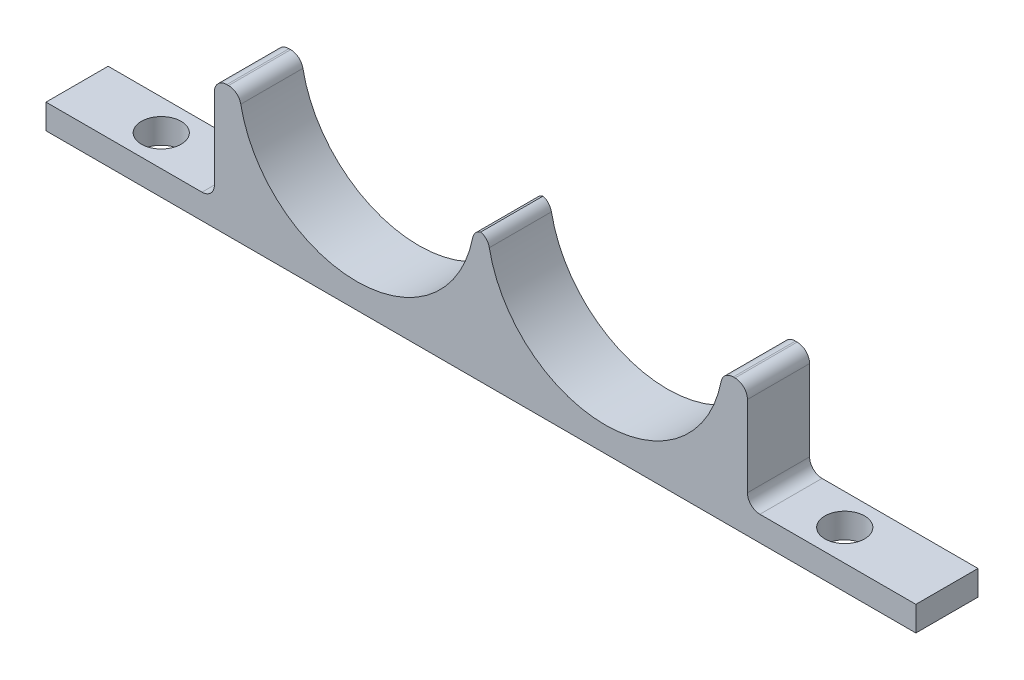
ISO-10303-21;
HEADER;
FILE_DESCRIPTION(('STEP AP214'),'2;1');
FILE_NAME('part.step','',(''),(''),'','','');
FILE_SCHEMA(('AUTOMOTIVE_DESIGN { 1 0 10303 214 1 1 1 1 }'));
ENDSEC;
DATA;
#1=APPLICATION_CONTEXT('core data for automotive mechanical design processes');
#2=APPLICATION_PROTOCOL_DEFINITION('international standard','automotive_design',2000,#1);
#3=PRODUCT_CONTEXT('',#1,'mechanical');
#4=PRODUCT('Part','Part','',(#3));
#5=PRODUCT_RELATED_PRODUCT_CATEGORY('part','',(#4));
#6=PRODUCT_DEFINITION_FORMATION('','',#4);
#7=PRODUCT_DEFINITION_CONTEXT('part definition',#1,'design');
#8=PRODUCT_DEFINITION('design','',#6,#7);
#9=PRODUCT_DEFINITION_SHAPE('','',#8);
#10=(LENGTH_UNIT() NAMED_UNIT(*) SI_UNIT(.MILLI.,.METRE.));
#11=(NAMED_UNIT(*) PLANE_ANGLE_UNIT() SI_UNIT($,.RADIAN.));
#12=(NAMED_UNIT(*) SI_UNIT($,.STERADIAN.) SOLID_ANGLE_UNIT());
#13=UNCERTAINTY_MEASURE_WITH_UNIT(LENGTH_MEASURE(1.E-05),#10,'distance_accuracy_value','');
#14=(GEOMETRIC_REPRESENTATION_CONTEXT(3) GLOBAL_UNCERTAINTY_ASSIGNED_CONTEXT((#13)) GLOBAL_UNIT_ASSIGNED_CONTEXT((#10,
#11,#12)) REPRESENTATION_CONTEXT('',''));
#15=CARTESIAN_POINT('',(0.,0.,0.));
#16=DIRECTION('',(0.,0.,1.));
#17=DIRECTION('',(1.,0.,0.));
#18=AXIS2_PLACEMENT_3D('',#15,#16,#17);
#19=CARTESIAN_POINT('',(0.,0.,5.));
#20=DIRECTION('',(1.,0.,0.));
#21=DIRECTION('',(0.,0.,-1.));
#22=AXIS2_PLACEMENT_3D('',#19,#20,#21);
#23=PLANE('',#22);
#24=DIRECTION('',(0.,-1.,0.));
#25=VECTOR('',#24,1.);
#26=CARTESIAN_POINT('',(0.,0.,0.));
#27=LINE('',#26,#25);
#28=CARTESIAN_POINT('',(0.,2.,0.));
#29=VERTEX_POINT('',#28);
#30=CARTESIAN_POINT('',(0.,0.,0.));
#31=VERTEX_POINT('',#30);
#32=EDGE_CURVE('E189',#29,#31,#27,.T.);
#33=ORIENTED_EDGE('',*,*,#32,.T.);
#34=DIRECTION('',(0.,0.,-1.));
#35=VECTOR('',#34,1.);
#36=CARTESIAN_POINT('',(0.,0.,5.));
#37=LINE('',#36,#35);
#38=CARTESIAN_POINT('',(0.,0.,5.));
#39=VERTEX_POINT('',#38);
#40=EDGE_CURVE('E170',#39,#31,#37,.T.);
#41=ORIENTED_EDGE('',*,*,#40,.F.);
#42=DIRECTION('',(0.,-1.,0.));
#43=VECTOR('',#42,1.);
#44=CARTESIAN_POINT('',(0.,0.,5.));
#45=LINE('',#44,#43);
#46=CARTESIAN_POINT('',(0.,2.,5.));
#47=VERTEX_POINT('',#46);
#48=EDGE_CURVE('E176',#47,#39,#45,.T.);
#49=ORIENTED_EDGE('',*,*,#48,.F.);
#50=DIRECTION('',(0.,0.,-1.));
#51=VECTOR('',#50,1.);
#52=CARTESIAN_POINT('',(0.,2.,5.));
#53=LINE('',#52,#51);
#54=EDGE_CURVE('E305',#47,#29,#53,.T.);
#55=ORIENTED_EDGE('',*,*,#54,.T.);
#56=EDGE_LOOP('',(#33,#41,#49,#55));
#57=FACE_BOUND('',#56,.T.);
#58=ADVANCED_FACE('F35',(#57),#23,.F.);
#59=CARTESIAN_POINT('',(0.,0.,5.));
#60=DIRECTION('',(0.,1.,0.));
#61=DIRECTION('',(0.,0.,1.));
#62=AXIS2_PLACEMENT_3D('',#59,#60,#61);
#63=PLANE('',#62);
#64=CARTESIAN_POINT('',(6.77638909307721,0.,2.5));
#65=DIRECTION('',(0.,1.,0.));
#66=DIRECTION('',(0.,0.,1.));
#67=AXIS2_PLACEMENT_3D('',#64,#65,#66);
#68=CIRCLE('',#67,1.6);
#69=CARTESIAN_POINT('',(6.77638909307721,0.,4.1));
#70=VERTEX_POINT('',#69);
#71=EDGE_CURVE('E308',#70,#70,#68,.T.);
#72=ORIENTED_EDGE('',*,*,#71,.T.);
#73=EDGE_LOOP('',(#72));
#74=FACE_BOUND('',#73,.T.);
#75=CARTESIAN_POINT('',(61.7763890930772,0.,2.5));
#76=DIRECTION('',(0.,1.,0.));
#77=DIRECTION('',(0.,0.,-1.));
#78=AXIS2_PLACEMENT_3D('',#75,#76,#77);
#79=CIRCLE('',#78,1.6);
#80=CARTESIAN_POINT('',(61.7763890930772,0.,0.900000000000002));
#81=VERTEX_POINT('',#80);
#82=EDGE_CURVE('E335',#81,#81,#79,.T.);
#83=ORIENTED_EDGE('',*,*,#82,.T.);
#84=EDGE_LOOP('',(#83));
#85=FACE_BOUND('',#84,.T.);
#86=DIRECTION('',(1.,0.,0.));
#87=VECTOR('',#86,1.);
#88=CARTESIAN_POINT('',(0.,0.,0.));
#89=LINE('',#88,#87);
#90=CARTESIAN_POINT('',(70.,0.,0.));
#91=VERTEX_POINT('',#90);
#92=EDGE_CURVE('E307',#31,#91,#89,.T.);
#93=ORIENTED_EDGE('',*,*,#92,.T.);
#94=DIRECTION('',(0.,0.,-1.));
#95=VECTOR('',#94,1.);
#96=CARTESIAN_POINT('',(70.,0.,5.));
#97=LINE('',#96,#95);
#98=CARTESIAN_POINT('',(70.,0.,5.));
#99=VERTEX_POINT('',#98);
#100=EDGE_CURVE('E173',#99,#91,#97,.T.);
#101=ORIENTED_EDGE('',*,*,#100,.F.);
#102=DIRECTION('',(1.,0.,0.));
#103=VECTOR('',#102,1.);
#104=CARTESIAN_POINT('',(0.,0.,5.));
#105=LINE('',#104,#103);
#106=EDGE_CURVE('E166',#39,#99,#105,.T.);
#107=ORIENTED_EDGE('',*,*,#106,.F.);
#108=ORIENTED_EDGE('',*,*,#40,.T.);
#109=EDGE_LOOP('',(#93,#101,#107,#108));
#110=FACE_BOUND('',#109,.T.);
#111=ADVANCED_FACE('F168',(#74,#85,#110),#63,.F.);
#112=CARTESIAN_POINT('',(70.,0.,5.));
#113=DIRECTION('',(-1.,0.,0.));
#114=DIRECTION('',(0.,0.,1.));
#115=AXIS2_PLACEMENT_3D('',#112,#113,#114);
#116=PLANE('',#115);
#117=DIRECTION('',(0.,1.,0.));
#118=VECTOR('',#117,1.);
#119=CARTESIAN_POINT('',(70.,0.,0.));
#120=LINE('',#119,#118);
#121=CARTESIAN_POINT('',(70.,2.,0.));
#122=VERTEX_POINT('',#121);
#123=EDGE_CURVE('E277',#91,#122,#120,.T.);
#124=ORIENTED_EDGE('',*,*,#123,.T.);
#125=DIRECTION('',(0.,0.,-1.));
#126=VECTOR('',#125,1.);
#127=CARTESIAN_POINT('',(70.,2.,5.));
#128=LINE('',#127,#126);
#129=CARTESIAN_POINT('',(70.,2.,5.));
#130=VERTEX_POINT('',#129);
#131=EDGE_CURVE('E195',#130,#122,#128,.T.);
#132=ORIENTED_EDGE('',*,*,#131,.F.);
#133=DIRECTION('',(0.,1.,0.));
#134=VECTOR('',#133,1.);
#135=CARTESIAN_POINT('',(70.,0.,5.));
#136=LINE('',#135,#134);
#137=EDGE_CURVE('E175',#99,#130,#136,.T.);
#138=ORIENTED_EDGE('',*,*,#137,.F.);
#139=ORIENTED_EDGE('',*,*,#100,.T.);
#140=EDGE_LOOP('',(#124,#132,#138,#139));
#141=FACE_BOUND('',#140,.T.);
#142=ADVANCED_FACE('F330',(#141),#116,.F.);
#143=CARTESIAN_POINT('',(56.4472218138456,2.,5.));
#144=DIRECTION('',(0.,-1.,0.));
#145=DIRECTION('',(0.,0.,-1.));
#146=AXIS2_PLACEMENT_3D('',#143,#144,#145);
#147=PLANE('',#146);
#148=CARTESIAN_POINT('',(61.7763890930772,2.,2.5));
#149=DIRECTION('',(0.,1.,0.));
#150=DIRECTION('',(0.,0.,-1.));
#151=AXIS2_PLACEMENT_3D('',#148,#149,#150);
#152=CIRCLE('',#151,1.6);
#153=CARTESIAN_POINT('',(61.7763890930772,2.,0.900000000000002));
#154=VERTEX_POINT('',#153);
#155=EDGE_CURVE('E332',#154,#154,#152,.T.);
#156=ORIENTED_EDGE('',*,*,#155,.F.);
#157=EDGE_LOOP('',(#156));
#158=FACE_BOUND('',#157,.T.);
#159=DIRECTION('',(-1.,0.,0.));
#160=VECTOR('',#159,1.);
#161=CARTESIAN_POINT('',(56.4472218138456,2.,0.));
#162=LINE('',#161,#160);
#163=CARTESIAN_POINT('',(57.4472218138456,2.,0.));
#164=VERTEX_POINT('',#163);
#165=EDGE_CURVE('E265',#122,#164,#162,.T.);
#166=ORIENTED_EDGE('',*,*,#165,.T.);
#167=DIRECTION('',(0.,0.,-1.));
#168=VECTOR('',#167,1.);
#169=CARTESIAN_POINT('',(57.4472218138456,2.,5.));
#170=LINE('',#169,#168);
#171=CARTESIAN_POINT('',(57.4472218138456,2.,5.));
#172=VERTEX_POINT('',#171);
#173=EDGE_CURVE('E211',#164,#172,#170,.F.);
#174=ORIENTED_EDGE('',*,*,#173,.T.);
#175=DIRECTION('',(-1.,0.,0.));
#176=VECTOR('',#175,1.);
#177=CARTESIAN_POINT('',(56.4472218138456,2.,5.));
#178=LINE('',#177,#176);
#179=EDGE_CURVE('E285',#130,#172,#178,.T.);
#180=ORIENTED_EDGE('',*,*,#179,.F.);
#181=ORIENTED_EDGE('',*,*,#131,.T.);
#182=EDGE_LOOP('',(#166,#174,#180,#181));
#183=FACE_BOUND('',#182,.T.);
#184=ADVANCED_FACE('F273',(#158,#183),#147,.F.);
#185=CARTESIAN_POINT('',(56.4472218138456,10.5,5.));
#186=DIRECTION('',(-1.,0.,0.));
#187=DIRECTION('',(0.,0.,1.));
#188=AXIS2_PLACEMENT_3D('',#185,#186,#187);
#189=PLANE('',#188);
#190=DIRECTION('',(0.,1.,0.));
#191=VECTOR('',#190,1.);
#192=CARTESIAN_POINT('',(56.4472218138456,10.5,5.));
#193=LINE('',#192,#191);
#194=CARTESIAN_POINT('',(56.4472218138456,3.,5.));
#195=VERTEX_POINT('',#194);
#196=CARTESIAN_POINT('',(56.4472218138456,9.5,5.));
#197=VERTEX_POINT('',#196);
#198=EDGE_CURVE('E283',#195,#197,#193,.T.);
#199=ORIENTED_EDGE('',*,*,#198,.F.);
#200=DIRECTION('',(0.,0.,-1.));
#201=VECTOR('',#200,1.);
#202=CARTESIAN_POINT('',(56.4472218138456,3.,0.));
#203=LINE('',#202,#201);
#204=CARTESIAN_POINT('',(56.4472218138456,3.,0.));
#205=VERTEX_POINT('',#204);
#206=EDGE_CURVE('E208',#195,#205,#203,.T.);
#207=ORIENTED_EDGE('',*,*,#206,.T.);
#208=DIRECTION('',(0.,1.,0.));
#209=VECTOR('',#208,1.);
#210=CARTESIAN_POINT('',(56.4472218138456,10.5,0.));
#211=LINE('',#210,#209);
#212=CARTESIAN_POINT('',(56.4472218138456,9.5,0.));
#213=VERTEX_POINT('',#212);
#214=EDGE_CURVE('E267',#205,#213,#211,.T.);
#215=ORIENTED_EDGE('',*,*,#214,.T.);
#216=DIRECTION('',(0.,0.,-1.));
#217=VECTOR('',#216,1.);
#218=CARTESIAN_POINT('',(56.4472218138456,9.5,5.));
#219=LINE('',#218,#217);
#220=EDGE_CURVE('E206',#213,#197,#219,.F.);
#221=ORIENTED_EDGE('',*,*,#220,.T.);
#222=EDGE_LOOP('',(#199,#207,#215,#221));
#223=FACE_BOUND('',#222,.T.);
#224=ADVANCED_FACE('F287',(#223),#189,.F.);
#225=CARTESIAN_POINT('',(54.4472218138456,10.5,5.));
#226=DIRECTION('',(0.,-1.,0.));
#227=DIRECTION('',(0.,0.,-1.));
#228=AXIS2_PLACEMENT_3D('',#225,#226,#227);
#229=PLANE('',#228);
#230=DIRECTION('',(-1.,0.,0.));
#231=VECTOR('',#230,1.);
#232=CARTESIAN_POINT('',(54.4472218138456,10.5,0.));
#233=LINE('',#232,#231);
#234=CARTESIAN_POINT('',(55.4472218138456,10.5,0.));
#235=VERTEX_POINT('',#234);
#236=CARTESIAN_POINT('',(55.3077640640442,10.5,0.));
#237=VERTEX_POINT('',#236);
#238=EDGE_CURVE('E312',#235,#237,#233,.T.);
#239=ORIENTED_EDGE('',*,*,#238,.T.);
#240=DIRECTION('',(0.,0.,-1.));
#241=VECTOR('',#240,1.);
#242=CARTESIAN_POINT('',(55.3077640640442,10.5,5.));
#243=LINE('',#242,#241);
#244=CARTESIAN_POINT('',(55.3077640640442,10.5,5.));
#245=VERTEX_POINT('',#244);
#246=EDGE_CURVE('E234',#237,#245,#243,.F.);
#247=ORIENTED_EDGE('',*,*,#246,.T.);
#248=DIRECTION('',(-1.,0.,0.));
#249=VECTOR('',#248,1.);
#250=CARTESIAN_POINT('',(54.4472218138456,10.5,5.));
#251=LINE('',#250,#249);
#252=CARTESIAN_POINT('',(55.4472218138456,10.5,5.));
#253=VERTEX_POINT('',#252);
#254=EDGE_CURVE('E289',#253,#245,#251,.T.);
#255=ORIENTED_EDGE('',*,*,#254,.F.);
#256=DIRECTION('',(0.,0.,-1.));
#257=VECTOR('',#256,1.);
#258=CARTESIAN_POINT('',(55.4472218138456,10.5,5.));
#259=LINE('',#258,#257);
#260=EDGE_CURVE('E231',#253,#235,#259,.T.);
#261=ORIENTED_EDGE('',*,*,#260,.T.);
#262=EDGE_LOOP('',(#239,#247,#255,#261));
#263=FACE_BOUND('',#262,.T.);
#264=ADVANCED_FACE('F426',(#263),#229,.F.);
#265=CARTESIAN_POINT('',(45.,11.5,5.));
#266=DIRECTION('',(0.,0.,-1.));
#267=DIRECTION('',(-1.,0.,0.));
#268=AXIS2_PLACEMENT_3D('',#265,#266,#267);
#269=CYLINDRICAL_SURFACE('',#268,9.50000000000001);
#270=CARTESIAN_POINT('',(45.,11.5,5.));
#271=DIRECTION('',(0.,0.,-1.));
#272=DIRECTION('',(1.,0.,0.));
#273=AXIS2_PLACEMENT_3D('',#270,#271,#272);
#274=CIRCLE('',#273,9.50000000000001);
#275=CARTESIAN_POINT('',(54.3260722484209,9.69047619047619,5.));
#276=VERTEX_POINT('',#275);
#277=CARTESIAN_POINT('',(35.6739277515791,9.69047619047619,5.));
#278=VERTEX_POINT('',#277);
#279=EDGE_CURVE('E291',#276,#278,#274,.T.);
#280=ORIENTED_EDGE('',*,*,#279,.F.);
#281=DIRECTION('',(0.,0.,-1.));
#282=VECTOR('',#281,1.);
#283=CARTESIAN_POINT('',(54.3260722484209,9.69047619047619,5.));
#284=LINE('',#283,#282);
#285=CARTESIAN_POINT('',(54.3260722484209,9.69047619047619,0.));
#286=VERTEX_POINT('',#285);
#287=EDGE_CURVE('E216',#276,#286,#284,.T.);
#288=ORIENTED_EDGE('',*,*,#287,.T.);
#289=CARTESIAN_POINT('',(45.,11.5,0.));
#290=DIRECTION('',(0.,0.,-1.));
#291=DIRECTION('',(1.,0.,0.));
#292=AXIS2_PLACEMENT_3D('',#289,#290,#291);
#293=CIRCLE('',#292,9.50000000000001);
#294=CARTESIAN_POINT('',(35.6739277515791,9.69047619047619,0.));
#295=VERTEX_POINT('',#294);
#296=EDGE_CURVE('E315',#286,#295,#293,.T.);
#297=ORIENTED_EDGE('',*,*,#296,.T.);
#298=DIRECTION('',(0.,0.,-1.));
#299=VECTOR('',#298,1.);
#300=CARTESIAN_POINT('',(35.6739277515791,9.69047619047619,5.));
#301=LINE('',#300,#299);
#302=EDGE_CURVE('E213',#295,#278,#301,.F.);
#303=ORIENTED_EDGE('',*,*,#302,.T.);
#304=EDGE_LOOP('',(#280,#288,#297,#303));
#305=FACE_BOUND('',#304,.T.);
#306=ADVANCED_FACE('F391',(#305),#269,.F.);
#307=CARTESIAN_POINT('',(25.,11.5,5.));
#308=DIRECTION('',(0.,0.,-1.));
#309=DIRECTION('',(-1.,0.,0.));
#310=AXIS2_PLACEMENT_3D('',#307,#308,#309);
#311=CYLINDRICAL_SURFACE('',#310,9.49999999999999);
#312=CARTESIAN_POINT('',(25.,11.5,5.));
#313=DIRECTION('',(0.,0.,-1.));
#314=DIRECTION('',(1.,0.,0.));
#315=AXIS2_PLACEMENT_3D('',#312,#313,#314);
#316=CIRCLE('',#315,9.49999999999999);
#317=CARTESIAN_POINT('',(34.3260722484209,9.69047619047619,5.));
#318=VERTEX_POINT('',#317);
#319=CARTESIAN_POINT('',(15.6739277515791,9.69047619047619,5.));
#320=VERTEX_POINT('',#319);
#321=EDGE_CURVE('E297',#318,#320,#316,.T.);
#322=ORIENTED_EDGE('',*,*,#321,.F.);
#323=DIRECTION('',(0.,0.,-1.));
#324=VECTOR('',#323,1.);
#325=CARTESIAN_POINT('',(34.3260722484209,9.69047619047619,5.));
#326=LINE('',#325,#324);
#327=CARTESIAN_POINT('',(34.3260722484209,9.69047619047619,0.));
#328=VERTEX_POINT('',#327);
#329=EDGE_CURVE('E248',#318,#328,#326,.T.);
#330=ORIENTED_EDGE('',*,*,#329,.T.);
#331=CARTESIAN_POINT('',(25.,11.5,0.));
#332=DIRECTION('',(0.,0.,-1.));
#333=DIRECTION('',(1.,0.,0.));
#334=AXIS2_PLACEMENT_3D('',#331,#332,#333);
#335=CIRCLE('',#334,9.49999999999999);
#336=CARTESIAN_POINT('',(15.6739277515791,9.69047619047619,0.));
#337=VERTEX_POINT('',#336);
#338=EDGE_CURVE('E318',#328,#337,#335,.T.);
#339=ORIENTED_EDGE('',*,*,#338,.T.);
#340=DIRECTION('',(0.,0.,-1.));
#341=VECTOR('',#340,1.);
#342=CARTESIAN_POINT('',(15.6739277515791,9.69047619047619,5.));
#343=LINE('',#342,#341);
#344=EDGE_CURVE('E246',#337,#320,#343,.F.);
#345=ORIENTED_EDGE('',*,*,#344,.T.);
#346=EDGE_LOOP('',(#322,#330,#339,#345));
#347=FACE_BOUND('',#346,.T.);
#348=ADVANCED_FACE('F380',(#347),#311,.F.);
#349=CARTESIAN_POINT('',(13.5527781861544,10.5,5.));
#350=DIRECTION('',(0.,-1.,0.));
#351=DIRECTION('',(0.,0.,-1.));
#352=AXIS2_PLACEMENT_3D('',#349,#350,#351);
#353=PLANE('',#352);
#354=DIRECTION('',(-1.,0.,0.));
#355=VECTOR('',#354,1.);
#356=CARTESIAN_POINT('',(13.5527781861544,10.5,5.));
#357=LINE('',#356,#355);
#358=CARTESIAN_POINT('',(14.6922359359559,10.5,5.));
#359=VERTEX_POINT('',#358);
#360=CARTESIAN_POINT('',(14.5527781861544,10.5,5.));
#361=VERTEX_POINT('',#360);
#362=EDGE_CURVE('E300',#359,#361,#357,.T.);
#363=ORIENTED_EDGE('',*,*,#362,.F.);
#364=DIRECTION('',(0.,0.,-1.));
#365=VECTOR('',#364,1.);
#366=CARTESIAN_POINT('',(14.6922359359559,10.5,5.));
#367=LINE('',#366,#365);
#368=CARTESIAN_POINT('',(14.6922359359559,10.5,0.));
#369=VERTEX_POINT('',#368);
#370=EDGE_CURVE('E252',#359,#369,#367,.T.);
#371=ORIENTED_EDGE('',*,*,#370,.T.);
#372=DIRECTION('',(-1.,0.,0.));
#373=VECTOR('',#372,1.);
#374=CARTESIAN_POINT('',(13.5527781861544,10.5,0.));
#375=LINE('',#374,#373);
#376=CARTESIAN_POINT('',(14.5527781861544,10.5,0.));
#377=VERTEX_POINT('',#376);
#378=EDGE_CURVE('E321',#369,#377,#375,.T.);
#379=ORIENTED_EDGE('',*,*,#378,.T.);
#380=DIRECTION('',(0.,0.,-1.));
#381=VECTOR('',#380,1.);
#382=CARTESIAN_POINT('',(14.5527781861544,10.5,5.));
#383=LINE('',#382,#381);
#384=EDGE_CURVE('E250',#377,#361,#383,.F.);
#385=ORIENTED_EDGE('',*,*,#384,.T.);
#386=EDGE_LOOP('',(#363,#371,#379,#385));
#387=FACE_BOUND('',#386,.T.);
#388=ADVANCED_FACE('F370',(#387),#353,.F.);
#389=CARTESIAN_POINT('',(13.5527781861544,10.5,5.));
#390=DIRECTION('',(1.,0.,0.));
#391=DIRECTION('',(0.,1.,0.));
#392=AXIS2_PLACEMENT_3D('',#389,#390,#391);
#393=PLANE('',#392);
#394=DIRECTION('',(0.,-1.,0.));
#395=VECTOR('',#394,1.);
#396=CARTESIAN_POINT('',(13.5527781861544,10.5,5.));
#397=LINE('',#396,#395);
#398=CARTESIAN_POINT('',(13.5527781861544,9.5,5.));
#399=VERTEX_POINT('',#398);
#400=CARTESIAN_POINT('',(13.5527781861544,3.,5.));
#401=VERTEX_POINT('',#400);
#402=EDGE_CURVE('E302',#399,#401,#397,.T.);
#403=ORIENTED_EDGE('',*,*,#402,.F.);
#404=DIRECTION('',(0.,0.,-1.));
#405=VECTOR('',#404,1.);
#406=CARTESIAN_POINT('',(13.5527781861544,9.5,5.));
#407=LINE('',#406,#405);
#408=CARTESIAN_POINT('',(13.5527781861544,9.5,0.));
#409=VERTEX_POINT('',#408);
#410=EDGE_CURVE('E255',#399,#409,#407,.T.);
#411=ORIENTED_EDGE('',*,*,#410,.T.);
#412=DIRECTION('',(0.,-1.,0.));
#413=VECTOR('',#412,1.);
#414=CARTESIAN_POINT('',(13.5527781861544,10.5,0.));
#415=LINE('',#414,#413);
#416=CARTESIAN_POINT('',(13.5527781861544,3.,0.));
#417=VERTEX_POINT('',#416);
#418=EDGE_CURVE('E324',#409,#417,#415,.T.);
#419=ORIENTED_EDGE('',*,*,#418,.T.);
#420=DIRECTION('',(0.,0.,-1.));
#421=VECTOR('',#420,1.);
#422=CARTESIAN_POINT('',(13.5527781861544,3.,5.));
#423=LINE('',#422,#421);
#424=EDGE_CURVE('E193',#417,#401,#423,.F.);
#425=ORIENTED_EDGE('',*,*,#424,.T.);
#426=EDGE_LOOP('',(#403,#411,#419,#425));
#427=FACE_BOUND('',#426,.T.);
#428=ADVANCED_FACE('F355',(#427),#393,.F.);
#429=CARTESIAN_POINT('',(13.5527781861544,2.,5.));
#430=DIRECTION('',(0.,-1.,0.));
#431=DIRECTION('',(0.,0.,-1.));
#432=AXIS2_PLACEMENT_3D('',#429,#430,#431);
#433=PLANE('',#432);
#434=CARTESIAN_POINT('',(6.77638909307721,2.,2.5));
#435=DIRECTION('',(0.,1.,0.));
#436=DIRECTION('',(0.,0.,1.));
#437=AXIS2_PLACEMENT_3D('',#434,#435,#436);
#438=CIRCLE('',#437,1.6);
#439=CARTESIAN_POINT('',(6.77638909307721,2.,4.1));
#440=VERTEX_POINT('',#439);
#441=EDGE_CURVE('E338',#440,#440,#438,.T.);
#442=ORIENTED_EDGE('',*,*,#441,.F.);
#443=EDGE_LOOP('',(#442));
#444=FACE_BOUND('',#443,.T.);
#445=DIRECTION('',(-1.,0.,0.));
#446=VECTOR('',#445,1.);
#447=CARTESIAN_POINT('',(13.5527781861544,2.,5.));
#448=LINE('',#447,#446);
#449=CARTESIAN_POINT('',(12.5527781861544,2.,5.));
#450=VERTEX_POINT('',#449);
#451=EDGE_CURVE('E182',#450,#47,#448,.T.);
#452=ORIENTED_EDGE('',*,*,#451,.F.);
#453=DIRECTION('',(0.,0.,-1.));
#454=VECTOR('',#453,1.);
#455=CARTESIAN_POINT('',(12.5527781861544,2.,0.));
#456=LINE('',#455,#454);
#457=CARTESIAN_POINT('',(12.5527781861544,2.,0.));
#458=VERTEX_POINT('',#457);
#459=EDGE_CURVE('E190',#450,#458,#456,.T.);
#460=ORIENTED_EDGE('',*,*,#459,.T.);
#461=DIRECTION('',(-1.,0.,0.));
#462=VECTOR('',#461,1.);
#463=CARTESIAN_POINT('',(13.5527781861544,2.,0.));
#464=LINE('',#463,#462);
#465=EDGE_CURVE('E186',#458,#29,#464,.T.);
#466=ORIENTED_EDGE('',*,*,#465,.T.);
#467=ORIENTED_EDGE('',*,*,#54,.F.);
#468=EDGE_LOOP('',(#452,#460,#466,#467));
#469=FACE_BOUND('',#468,.T.);
#470=ADVANCED_FACE('F353',(#444,#469),#433,.F.);
#471=CARTESIAN_POINT('',(25.,11.5,5.));
#472=DIRECTION('',(0.,0.,1.));
#473=DIRECTION('',(1.,0.,0.));
#474=AXIS2_PLACEMENT_3D('',#471,#472,#473);
#475=PLANE('',#474);
#476=ORIENTED_EDGE('',*,*,#254,.T.);
#477=CARTESIAN_POINT('',(55.3077640640442,9.5,5.));
#478=DIRECTION('',(0.,0.,1.));
#479=DIRECTION('',(1.,0.,0.));
#480=AXIS2_PLACEMENT_3D('',#477,#478,#479);
#481=CIRCLE('',#480,1.);
#482=EDGE_CURVE('E244',#245,#276,#481,.T.);
#483=ORIENTED_EDGE('',*,*,#482,.T.);
#484=ORIENTED_EDGE('',*,*,#279,.T.);
#485=CARTESIAN_POINT('',(34.6922359359558,9.5,5.));
#486=DIRECTION('',(0.,0.,1.));
#487=DIRECTION('',(1.,0.,0.));
#488=AXIS2_PLACEMENT_3D('',#485,#486,#487);
#489=CIRCLE('',#488,1.);
#490=CARTESIAN_POINT('',(35.,10.4514627059864,5.));
#491=VERTEX_POINT('',#490);
#492=EDGE_CURVE('E51',#278,#491,#489,.T.);
#493=ORIENTED_EDGE('',*,*,#492,.T.);
#494=CARTESIAN_POINT('',(35.3077640640442,9.5,5.));
#495=DIRECTION('',(0.,0.,1.));
#496=DIRECTION('',(1.,0.,0.));
#497=AXIS2_PLACEMENT_3D('',#494,#495,#496);
#498=CIRCLE('',#497,1.);
#499=EDGE_CURVE('E239',#491,#318,#498,.T.);
#500=ORIENTED_EDGE('',*,*,#499,.T.);
#501=ORIENTED_EDGE('',*,*,#321,.T.);
#502=CARTESIAN_POINT('',(14.6922359359559,9.5,5.));
#503=DIRECTION('',(0.,0.,1.));
#504=DIRECTION('',(1.,0.,0.));
#505=AXIS2_PLACEMENT_3D('',#502,#503,#504);
#506=CIRCLE('',#505,1.);
#507=EDGE_CURVE('E237',#320,#359,#506,.T.);
#508=ORIENTED_EDGE('',*,*,#507,.T.);
#509=ORIENTED_EDGE('',*,*,#362,.T.);
#510=CARTESIAN_POINT('',(14.5527781861544,9.5,5.));
#511=DIRECTION('',(0.,0.,1.));
#512=DIRECTION('',(1.,0.,0.));
#513=AXIS2_PLACEMENT_3D('',#510,#511,#512);
#514=CIRCLE('',#513,1.);
#515=EDGE_CURVE('E58',#361,#399,#514,.T.);
#516=ORIENTED_EDGE('',*,*,#515,.T.);
#517=ORIENTED_EDGE('',*,*,#402,.T.);
#518=CARTESIAN_POINT('',(12.5527781861544,3.,5.));
#519=DIRECTION('',(0.,0.,1.));
#520=DIRECTION('',(1.,0.,0.));
#521=AXIS2_PLACEMENT_3D('',#518,#519,#520);
#522=CIRCLE('',#521,1.);
#523=EDGE_CURVE('E204',#401,#450,#522,.F.);
#524=ORIENTED_EDGE('',*,*,#523,.T.);
#525=ORIENTED_EDGE('',*,*,#451,.T.);
#526=ORIENTED_EDGE('',*,*,#48,.T.);
#527=ORIENTED_EDGE('',*,*,#106,.T.);
#528=ORIENTED_EDGE('',*,*,#137,.T.);
#529=ORIENTED_EDGE('',*,*,#179,.T.);
#530=CARTESIAN_POINT('',(57.4472218138456,3.,5.));
#531=DIRECTION('',(0.,0.,1.));
#532=DIRECTION('',(1.,0.,0.));
#533=AXIS2_PLACEMENT_3D('',#530,#531,#532);
#534=CIRCLE('',#533,1.);
#535=EDGE_CURVE('E11',#172,#195,#534,.F.);
#536=ORIENTED_EDGE('',*,*,#535,.T.);
#537=ORIENTED_EDGE('',*,*,#198,.T.);
#538=CARTESIAN_POINT('',(55.4472218138456,9.5,5.));
#539=DIRECTION('',(0.,0.,1.));
#540=DIRECTION('',(1.,0.,0.));
#541=AXIS2_PLACEMENT_3D('',#538,#539,#540);
#542=CIRCLE('',#541,1.);
#543=EDGE_CURVE('E242',#197,#253,#542,.T.);
#544=ORIENTED_EDGE('',*,*,#543,.T.);
#545=EDGE_LOOP('',(#476,#483,#484,#493,#500,#501,#508,#509,#516,#517,#524,#525,#526,#527,#528,
#529,#536,#537,#544));
#546=FACE_BOUND('',#545,.T.);
#547=ADVANCED_FACE('F180',(#546),#475,.T.);
#548=CARTESIAN_POINT('',(25.,11.5,0.));
#549=DIRECTION('',(0.,0.,1.));
#550=DIRECTION('',(1.,0.,0.));
#551=AXIS2_PLACEMENT_3D('',#548,#549,#550);
#552=PLANE('',#551);
#553=ORIENTED_EDGE('',*,*,#296,.F.);
#554=CARTESIAN_POINT('',(55.3077640640442,9.5,0.));
#555=DIRECTION('',(0.,0.,1.));
#556=DIRECTION('',(1.,0.,0.));
#557=AXIS2_PLACEMENT_3D('',#554,#555,#556);
#558=CIRCLE('',#557,1.);
#559=EDGE_CURVE('E229',#286,#237,#558,.F.);
#560=ORIENTED_EDGE('',*,*,#559,.T.);
#561=ORIENTED_EDGE('',*,*,#238,.F.);
#562=CARTESIAN_POINT('',(55.4472218138456,9.5,0.));
#563=DIRECTION('',(0.,0.,1.));
#564=DIRECTION('',(1.,0.,0.));
#565=AXIS2_PLACEMENT_3D('',#562,#563,#564);
#566=CIRCLE('',#565,1.);
#567=EDGE_CURVE('E227',#235,#213,#566,.F.);
#568=ORIENTED_EDGE('',*,*,#567,.T.);
#569=ORIENTED_EDGE('',*,*,#214,.F.);
#570=CARTESIAN_POINT('',(57.4472218138456,3.,0.));
#571=DIRECTION('',(0.,0.,1.));
#572=DIRECTION('',(1.,0.,0.));
#573=AXIS2_PLACEMENT_3D('',#570,#571,#572);
#574=CIRCLE('',#573,1.);
#575=EDGE_CURVE('E44',#205,#164,#574,.T.);
#576=ORIENTED_EDGE('',*,*,#575,.T.);
#577=ORIENTED_EDGE('',*,*,#165,.F.);
#578=ORIENTED_EDGE('',*,*,#123,.F.);
#579=ORIENTED_EDGE('',*,*,#92,.F.);
#580=ORIENTED_EDGE('',*,*,#32,.F.);
#581=ORIENTED_EDGE('',*,*,#465,.F.);
#582=CARTESIAN_POINT('',(12.5527781861544,3.,0.));
#583=DIRECTION('',(0.,0.,1.));
#584=DIRECTION('',(1.,0.,0.));
#585=AXIS2_PLACEMENT_3D('',#582,#583,#584);
#586=CIRCLE('',#585,1.);
#587=EDGE_CURVE('E201',#458,#417,#586,.T.);
#588=ORIENTED_EDGE('',*,*,#587,.T.);
#589=ORIENTED_EDGE('',*,*,#418,.F.);
#590=CARTESIAN_POINT('',(14.5527781861544,9.5,0.));
#591=DIRECTION('',(0.,0.,1.));
#592=DIRECTION('',(1.,0.,0.));
#593=AXIS2_PLACEMENT_3D('',#590,#591,#592);
#594=CIRCLE('',#593,1.);
#595=EDGE_CURVE('E219',#409,#377,#594,.F.);
#596=ORIENTED_EDGE('',*,*,#595,.T.);
#597=ORIENTED_EDGE('',*,*,#378,.F.);
#598=CARTESIAN_POINT('',(14.6922359359559,9.5,0.));
#599=DIRECTION('',(0.,0.,1.));
#600=DIRECTION('',(1.,0.,0.));
#601=AXIS2_PLACEMENT_3D('',#598,#599,#600);
#602=CIRCLE('',#601,1.);
#603=EDGE_CURVE('E221',#369,#337,#602,.F.);
#604=ORIENTED_EDGE('',*,*,#603,.T.);
#605=ORIENTED_EDGE('',*,*,#338,.F.);
#606=CARTESIAN_POINT('',(35.3077640640442,9.5,0.));
#607=DIRECTION('',(0.,0.,1.));
#608=DIRECTION('',(1.,0.,0.));
#609=AXIS2_PLACEMENT_3D('',#606,#607,#608);
#610=CIRCLE('',#609,1.);
#611=CARTESIAN_POINT('',(35.,10.4514627059864,0.));
#612=VERTEX_POINT('',#611);
#613=EDGE_CURVE('E223',#328,#612,#610,.F.);
#614=ORIENTED_EDGE('',*,*,#613,.T.);
#615=CARTESIAN_POINT('',(34.6922359359558,9.5,0.));
#616=DIRECTION('',(0.,0.,1.));
#617=DIRECTION('',(1.,0.,0.));
#618=AXIS2_PLACEMENT_3D('',#615,#616,#617);
#619=CIRCLE('',#618,1.);
#620=EDGE_CURVE('E225',#612,#295,#619,.F.);
#621=ORIENTED_EDGE('',*,*,#620,.T.);
#622=EDGE_LOOP('',(#553,#560,#561,#568,#569,#576,#577,#578,#579,#580,#581,#588,#589,#596,#597,
#604,#605,#614,#621));
#623=FACE_BOUND('',#622,.T.);
#624=ADVANCED_FACE('F263',(#623),#552,.F.);
#625=CARTESIAN_POINT('',(6.77638909307721,0.,2.5));
#626=DIRECTION('',(0.,1.,0.));
#627=DIRECTION('',(0.,0.,1.));
#628=AXIS2_PLACEMENT_3D('',#625,#626,#627);
#629=CYLINDRICAL_SURFACE('',#628,1.6);
#630=ORIENTED_EDGE('',*,*,#71,.F.);
#631=EDGE_LOOP('',(#630));
#632=FACE_BOUND('',#631,.T.);
#633=ORIENTED_EDGE('',*,*,#441,.T.);
#634=EDGE_LOOP('',(#633));
#635=FACE_BOUND('',#634,.T.);
#636=ADVANCED_FACE('F346',(#632,#635),#629,.F.);
#637=CARTESIAN_POINT('',(61.7763890930772,0.,2.5));
#638=DIRECTION('',(0.,1.,0.));
#639=DIRECTION('',(0.,0.,1.));
#640=AXIS2_PLACEMENT_3D('',#637,#638,#639);
#641=CYLINDRICAL_SURFACE('',#640,1.6);
#642=ORIENTED_EDGE('',*,*,#82,.F.);
#643=EDGE_LOOP('',(#642));
#644=FACE_BOUND('',#643,.T.);
#645=ORIENTED_EDGE('',*,*,#155,.T.);
#646=EDGE_LOOP('',(#645));
#647=FACE_BOUND('',#646,.T.);
#648=ADVANCED_FACE('F349',(#644,#647),#641,.F.);
#649=CARTESIAN_POINT('',(12.5527781861544,3.,5.));
#650=DIRECTION('',(0.,0.,1.));
#651=DIRECTION('',(1.,0.,0.));
#652=AXIS2_PLACEMENT_3D('',#649,#650,#651);
#653=CYLINDRICAL_SURFACE('',#652,1.);
#654=ORIENTED_EDGE('',*,*,#523,.F.);
#655=ORIENTED_EDGE('',*,*,#424,.F.);
#656=ORIENTED_EDGE('',*,*,#587,.F.);
#657=ORIENTED_EDGE('',*,*,#459,.F.);
#658=EDGE_LOOP('',(#654,#655,#656,#657));
#659=FACE_BOUND('',#658,.T.);
#660=ADVANCED_FACE('F360',(#659),#653,.F.);
#661=CARTESIAN_POINT('',(57.4472218138456,3.,5.));
#662=DIRECTION('',(0.,0.,1.));
#663=DIRECTION('',(1.,0.,0.));
#664=AXIS2_PLACEMENT_3D('',#661,#662,#663);
#665=CYLINDRICAL_SURFACE('',#664,1.);
#666=ORIENTED_EDGE('',*,*,#535,.F.);
#667=ORIENTED_EDGE('',*,*,#173,.F.);
#668=ORIENTED_EDGE('',*,*,#575,.F.);
#669=ORIENTED_EDGE('',*,*,#206,.F.);
#670=EDGE_LOOP('',(#666,#667,#668,#669));
#671=FACE_BOUND('',#670,.T.);
#672=ADVANCED_FACE('F280',(#671),#665,.F.);
#673=CARTESIAN_POINT('',(55.3077640640442,9.5,5.));
#674=DIRECTION('',(0.,0.,-1.));
#675=DIRECTION('',(-1.,0.,0.));
#676=AXIS2_PLACEMENT_3D('',#673,#674,#675);
#677=CYLINDRICAL_SURFACE('',#676,1.);
#678=ORIENTED_EDGE('',*,*,#482,.F.);
#679=ORIENTED_EDGE('',*,*,#246,.F.);
#680=ORIENTED_EDGE('',*,*,#559,.F.);
#681=ORIENTED_EDGE('',*,*,#287,.F.);
#682=EDGE_LOOP('',(#678,#679,#680,#681));
#683=FACE_BOUND('',#682,.T.);
#684=ADVANCED_FACE('F415',(#683),#677,.T.);
#685=CARTESIAN_POINT('',(55.4472218138456,9.5,5.));
#686=DIRECTION('',(0.,0.,-1.));
#687=DIRECTION('',(-1.,0.,0.));
#688=AXIS2_PLACEMENT_3D('',#685,#686,#687);
#689=CYLINDRICAL_SURFACE('',#688,1.);
#690=ORIENTED_EDGE('',*,*,#543,.F.);
#691=ORIENTED_EDGE('',*,*,#220,.F.);
#692=ORIENTED_EDGE('',*,*,#567,.F.);
#693=ORIENTED_EDGE('',*,*,#260,.F.);
#694=EDGE_LOOP('',(#690,#691,#692,#693));
#695=FACE_BOUND('',#694,.T.);
#696=ADVANCED_FACE('F400',(#695),#689,.T.);
#697=CARTESIAN_POINT('',(35.3077640640442,9.5,5.));
#698=DIRECTION('',(0.,0.,-1.));
#699=DIRECTION('',(-1.,0.,0.));
#700=AXIS2_PLACEMENT_3D('',#697,#698,#699);
#701=CYLINDRICAL_SURFACE('',#700,1.);
#702=ORIENTED_EDGE('',*,*,#329,.F.);
#703=ORIENTED_EDGE('',*,*,#499,.F.);
#704=DIRECTION('',(0.,0.,-1.));
#705=VECTOR('',#704,1.);
#706=CARTESIAN_POINT('',(35.,10.4514627059864,2.5));
#707=LINE('',#706,#705);
#708=EDGE_CURVE('E39',#612,#491,#707,.F.);
#709=ORIENTED_EDGE('',*,*,#708,.F.);
#710=ORIENTED_EDGE('',*,*,#613,.F.);
#711=EDGE_LOOP('',(#702,#703,#709,#710));
#712=FACE_BOUND('',#711,.T.);
#713=ADVANCED_FACE('F383',(#712),#701,.T.);
#714=CARTESIAN_POINT('',(34.6922359359558,9.5,5.));
#715=DIRECTION('',(0.,0.,-1.));
#716=DIRECTION('',(-1.,0.,0.));
#717=AXIS2_PLACEMENT_3D('',#714,#715,#716);
#718=CYLINDRICAL_SURFACE('',#717,1.);
#719=ORIENTED_EDGE('',*,*,#492,.F.);
#720=ORIENTED_EDGE('',*,*,#302,.F.);
#721=ORIENTED_EDGE('',*,*,#620,.F.);
#722=ORIENTED_EDGE('',*,*,#708,.T.);
#723=EDGE_LOOP('',(#719,#720,#721,#722));
#724=FACE_BOUND('',#723,.T.);
#725=ADVANCED_FACE('F393',(#724),#718,.T.);
#726=CARTESIAN_POINT('',(14.6922359359559,9.5,5.));
#727=DIRECTION('',(0.,0.,-1.));
#728=DIRECTION('',(-1.,0.,0.));
#729=AXIS2_PLACEMENT_3D('',#726,#727,#728);
#730=CYLINDRICAL_SURFACE('',#729,1.);
#731=ORIENTED_EDGE('',*,*,#507,.F.);
#732=ORIENTED_EDGE('',*,*,#344,.F.);
#733=ORIENTED_EDGE('',*,*,#603,.F.);
#734=ORIENTED_EDGE('',*,*,#370,.F.);
#735=EDGE_LOOP('',(#731,#732,#733,#734));
#736=FACE_BOUND('',#735,.T.);
#737=ADVANCED_FACE('F376',(#736),#730,.T.);
#738=CARTESIAN_POINT('',(14.5527781861544,9.5,5.));
#739=DIRECTION('',(0.,0.,-1.));
#740=DIRECTION('',(-1.,0.,0.));
#741=AXIS2_PLACEMENT_3D('',#738,#739,#740);
#742=CYLINDRICAL_SURFACE('',#741,1.);
#743=ORIENTED_EDGE('',*,*,#515,.F.);
#744=ORIENTED_EDGE('',*,*,#384,.F.);
#745=ORIENTED_EDGE('',*,*,#595,.F.);
#746=ORIENTED_EDGE('',*,*,#410,.F.);
#747=EDGE_LOOP('',(#743,#744,#745,#746));
#748=FACE_BOUND('',#747,.T.);
#749=ADVANCED_FACE('F37',(#748),#742,.T.);
#750=CLOSED_SHELL('',(#58,#111,#142,#184,#224,#264,#306,#348,#388,#428,#470,#547,#624,#636,#648,
#660,#672,#684,#696,#713,#725,#737,#749));
#751=MANIFOLD_SOLID_BREP('B2',#750);
#752=ADVANCED_BREP_SHAPE_REPRESENTATION('',(#18,#751),#14);
#753=SHAPE_DEFINITION_REPRESENTATION(#9,#752);
ENDSEC;
END-ISO-10303-21;
